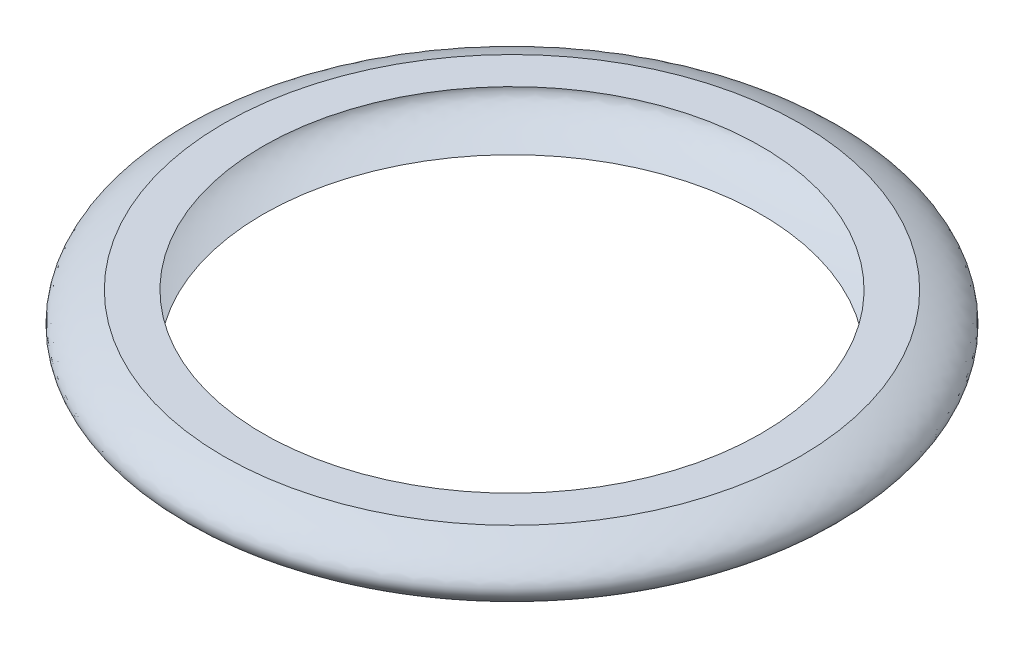
ISO-10303-21;
HEADER;
FILE_DESCRIPTION(('STEP AP214'),'2;1');
FILE_NAME('part.step','',(''),(''),'','','');
FILE_SCHEMA(('AUTOMOTIVE_DESIGN { 1 0 10303 214 1 1 1 1 }'));
ENDSEC;
DATA;
#1=APPLICATION_CONTEXT('core data for automotive mechanical design processes');
#2=APPLICATION_PROTOCOL_DEFINITION('international standard','automotive_design',2000,#1);
#3=PRODUCT_CONTEXT('',#1,'mechanical');
#4=PRODUCT('Part','Part','',(#3));
#5=PRODUCT_RELATED_PRODUCT_CATEGORY('part','',(#4));
#6=PRODUCT_DEFINITION_FORMATION('','',#4);
#7=PRODUCT_DEFINITION_CONTEXT('part definition',#1,'design');
#8=PRODUCT_DEFINITION('design','',#6,#7);
#9=PRODUCT_DEFINITION_SHAPE('','',#8);
#10=(LENGTH_UNIT() NAMED_UNIT(*) SI_UNIT(.MILLI.,.METRE.));
#11=(NAMED_UNIT(*) PLANE_ANGLE_UNIT() SI_UNIT($,.RADIAN.));
#12=(NAMED_UNIT(*) SI_UNIT($,.STERADIAN.) SOLID_ANGLE_UNIT());
#13=UNCERTAINTY_MEASURE_WITH_UNIT(LENGTH_MEASURE(1.E-05),#10,'distance_accuracy_value','');
#14=(GEOMETRIC_REPRESENTATION_CONTEXT(3) GLOBAL_UNCERTAINTY_ASSIGNED_CONTEXT((#13)) GLOBAL_UNIT_ASSIGNED_CONTEXT((#10,
#11,#12)) REPRESENTATION_CONTEXT('',''));
#15=CARTESIAN_POINT('',(0.,0.,0.));
#16=DIRECTION('',(0.,0.,1.));
#17=DIRECTION('',(1.,0.,0.));
#18=AXIS2_PLACEMENT_3D('',#15,#16,#17);
#19=CARTESIAN_POINT('',(-31.665,0.,0.));
#20=CARTESIAN_POINT('',(-42.165,3.75,0.));
#21=CARTESIAN_POINT('',(-31.665,7.5,0.));
#22=B_SPLINE_CURVE_WITH_KNOTS('',2,(#19,#20,#21),.UNSPECIFIED.,.F.,.F.,(3,3),(0.,1.),.UNSPECIFIED.);
#23=CARTESIAN_POINT('',(0.,7.50000000000001,0.));
#24=DIRECTION('',(0.,1.,0.));
#25=AXIS1_PLACEMENT('',#23,#24);
#26=SURFACE_OF_REVOLUTION('',#22,#25);
#27=CARTESIAN_POINT('',(0.,7.5,0.));
#28=DIRECTION('',(0.,1.,0.));
#29=DIRECTION('',(-1.,0.,0.));
#30=AXIS2_PLACEMENT_3D('',#27,#28,#29);
#31=CIRCLE('',#30,31.665);
#32=CARTESIAN_POINT('',(-31.665,7.5,0.));
#33=VERTEX_POINT('',#32);
#34=EDGE_CURVE('E10',#33,#33,#31,.T.);
#35=ORIENTED_EDGE('',*,*,#34,.T.);
#36=EDGE_LOOP('',(#35));
#37=FACE_BOUND('',#36,.T.);
#38=CARTESIAN_POINT('',(0.,0.,0.));
#39=DIRECTION('',(0.,1.,0.));
#40=DIRECTION('',(-1.,0.,0.));
#41=AXIS2_PLACEMENT_3D('',#38,#39,#40);
#42=CIRCLE('',#41,31.665);
#43=CARTESIAN_POINT('',(-31.665,0.,0.));
#44=VERTEX_POINT('',#43);
#45=EDGE_CURVE('E55',#44,#44,#42,.T.);
#46=ORIENTED_EDGE('',*,*,#45,.F.);
#47=EDGE_LOOP('',(#46));
#48=FACE_BOUND('',#47,.T.);
#49=ADVANCED_FACE('F37',(#37,#48),#26,.F.);
#50=CARTESIAN_POINT('',(-31.665,7.49999999999998,0.));
#51=DIRECTION('',(0.,1.,0.));
#52=DIRECTION('',(-1.,0.,0.));
#53=AXIS2_PLACEMENT_3D('',#50,#51,#52);
#54=PLANE('',#53);
#55=CARTESIAN_POINT('',(0.,7.49999999999997,0.));
#56=DIRECTION('',(0.,1.,0.));
#57=DIRECTION('',(-1.,0.,0.));
#58=AXIS2_PLACEMENT_3D('',#55,#56,#57);
#59=CIRCLE('',#58,36.665);
#60=CARTESIAN_POINT('',(-36.665,7.49999999999997,0.));
#61=VERTEX_POINT('',#60);
#62=EDGE_CURVE('E45',#61,#61,#59,.T.);
#63=ORIENTED_EDGE('',*,*,#62,.T.);
#64=EDGE_LOOP('',(#63));
#65=FACE_BOUND('',#64,.T.);
#66=ORIENTED_EDGE('',*,*,#34,.F.);
#67=EDGE_LOOP('',(#66));
#68=FACE_BOUND('',#67,.T.);
#69=ADVANCED_FACE('F75',(#65,#68),#54,.T.);
#70=CARTESIAN_POINT('',(-36.665,7.49999999999997,0.));
#71=CARTESIAN_POINT('',(-47.165,3.74999999999996,0.));
#72=CARTESIAN_POINT('',(-36.665,0.,0.));
#73=B_SPLINE_CURVE_WITH_KNOTS('',2,(#70,#71,#72),.UNSPECIFIED.,.F.,.F.,(3,3),(0.,1.),.UNSPECIFIED.);
#74=CARTESIAN_POINT('',(0.,7.50000000000001,0.));
#75=DIRECTION('',(0.,1.,0.));
#76=AXIS1_PLACEMENT('',#74,#75);
#77=SURFACE_OF_REVOLUTION('',#73,#76);
#78=CARTESIAN_POINT('',(0.,0.,0.));
#79=DIRECTION('',(0.,1.,0.));
#80=DIRECTION('',(-1.,0.,0.));
#81=AXIS2_PLACEMENT_3D('',#78,#79,#80);
#82=CIRCLE('',#81,36.665);
#83=CARTESIAN_POINT('',(-36.665,0.,0.));
#84=VERTEX_POINT('',#83);
#85=EDGE_CURVE('E50',#84,#84,#82,.T.);
#86=ORIENTED_EDGE('',*,*,#85,.T.);
#87=EDGE_LOOP('',(#86));
#88=FACE_BOUND('',#87,.T.);
#89=ORIENTED_EDGE('',*,*,#62,.F.);
#90=EDGE_LOOP('',(#89));
#91=FACE_BOUND('',#90,.T.);
#92=ADVANCED_FACE('F71',(#88,#91),#77,.F.);
#93=CARTESIAN_POINT('',(-31.665,0.,0.));
#94=DIRECTION('',(0.,-1.,0.));
#95=DIRECTION('',(1.,0.,0.));
#96=AXIS2_PLACEMENT_3D('',#93,#94,#95);
#97=PLANE('',#96);
#98=ORIENTED_EDGE('',*,*,#45,.T.);
#99=EDGE_LOOP('',(#98));
#100=FACE_BOUND('',#99,.T.);
#101=ORIENTED_EDGE('',*,*,#85,.F.);
#102=EDGE_LOOP('',(#101));
#103=FACE_BOUND('',#102,.T.);
#104=ADVANCED_FACE('F74',(#100,#103),#97,.T.);
#105=CLOSED_SHELL('',(#49,#69,#92,#104));
#106=MANIFOLD_SOLID_BREP('B2',#105);
#107=ADVANCED_BREP_SHAPE_REPRESENTATION('',(#18,#106),#14);
#108=SHAPE_DEFINITION_REPRESENTATION(#9,#107);
ENDSEC;
END-ISO-10303-21;
